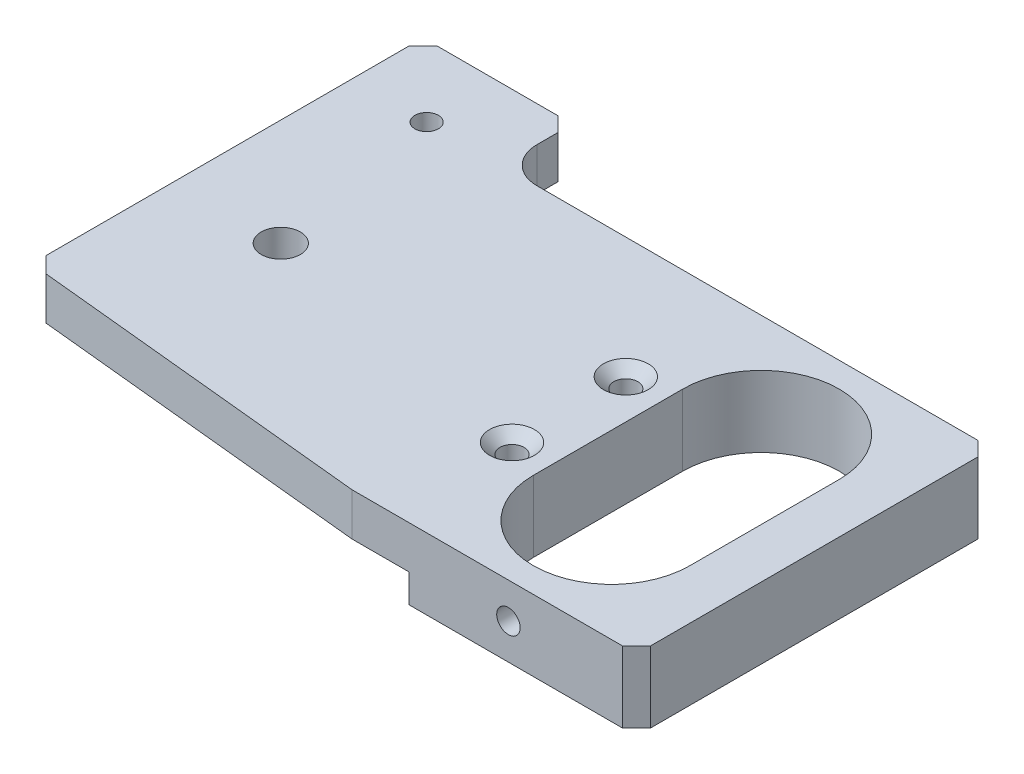
ISO-10303-21;
HEADER;
FILE_DESCRIPTION(('STEP AP214'),'2;1');
FILE_NAME('part.step','',(''),(''),'','','');
FILE_SCHEMA(('AUTOMOTIVE_DESIGN { 1 0 10303 214 1 1 1 1 }'));
ENDSEC;
DATA;
#1=APPLICATION_CONTEXT('core data for automotive mechanical design processes');
#2=APPLICATION_PROTOCOL_DEFINITION('international standard','automotive_design',2000,#1);
#3=PRODUCT_CONTEXT('',#1,'mechanical');
#4=PRODUCT('Part','Part','',(#3));
#5=PRODUCT_RELATED_PRODUCT_CATEGORY('part','',(#4));
#6=PRODUCT_DEFINITION_FORMATION('','',#4);
#7=PRODUCT_DEFINITION_CONTEXT('part definition',#1,'design');
#8=PRODUCT_DEFINITION('design','',#6,#7);
#9=PRODUCT_DEFINITION_SHAPE('','',#8);
#10=(LENGTH_UNIT() NAMED_UNIT(*) SI_UNIT(.MILLI.,.METRE.));
#11=(NAMED_UNIT(*) PLANE_ANGLE_UNIT() SI_UNIT($,.RADIAN.));
#12=(NAMED_UNIT(*) SI_UNIT($,.STERADIAN.) SOLID_ANGLE_UNIT());
#13=UNCERTAINTY_MEASURE_WITH_UNIT(LENGTH_MEASURE(1.E-05),#10,'distance_accuracy_value','');
#14=(GEOMETRIC_REPRESENTATION_CONTEXT(3) GLOBAL_UNCERTAINTY_ASSIGNED_CONTEXT((#13)) GLOBAL_UNIT_ASSIGNED_CONTEXT((#10,
#11,#12)) REPRESENTATION_CONTEXT('',''));
#15=CARTESIAN_POINT('',(0.,0.,0.));
#16=DIRECTION('',(0.,0.,1.));
#17=DIRECTION('',(1.,0.,0.));
#18=AXIS2_PLACEMENT_3D('',#15,#16,#17);
#19=CARTESIAN_POINT('',(0.,0.,0.));
#20=DIRECTION('',(0.,1.,0.));
#21=DIRECTION('',(0.,0.,1.));
#22=AXIS2_PLACEMENT_3D('',#19,#20,#21);
#23=PLANE('',#22);
#24=CARTESIAN_POINT('',(-39.5,0.,-25.));
#25=DIRECTION('',(0.,1.,0.));
#26=DIRECTION('',(0.,0.,1.));
#27=AXIS2_PLACEMENT_3D('',#24,#25,#26);
#28=CIRCLE('',#27,1.65);
#29=CARTESIAN_POINT('',(-39.5,0.,-23.35));
#30=VERTEX_POINT('',#29);
#31=EDGE_CURVE('E531',#30,#30,#28,.T.);
#32=ORIENTED_EDGE('',*,*,#31,.T.);
#33=EDGE_LOOP('',(#32));
#34=FACE_BOUND('',#33,.T.);
#35=CARTESIAN_POINT('',(5.5,0.,-8.));
#36=DIRECTION('',(0.,1.,0.));
#37=DIRECTION('',(0.,0.,1.));
#38=AXIS2_PLACEMENT_3D('',#35,#36,#37);
#39=CIRCLE('',#38,1.69999999999999);
#40=CARTESIAN_POINT('',(5.5,0.,-6.30000000000001));
#41=VERTEX_POINT('',#40);
#42=EDGE_CURVE('E275',#41,#41,#39,.T.);
#43=ORIENTED_EDGE('',*,*,#42,.T.);
#44=EDGE_LOOP('',(#43));
#45=FACE_BOUND('',#44,.T.);
#46=CARTESIAN_POINT('',(5.5,0.,8.));
#47=DIRECTION('',(0.,1.,0.));
#48=DIRECTION('',(0.,0.,1.));
#49=AXIS2_PLACEMENT_3D('',#46,#47,#48);
#50=CIRCLE('',#49,1.69999999999999);
#51=CARTESIAN_POINT('',(5.5,0.,9.69999999999999));
#52=VERTEX_POINT('',#51);
#53=EDGE_CURVE('E270',#52,#52,#50,.T.);
#54=ORIENTED_EDGE('',*,*,#53,.T.);
#55=EDGE_LOOP('',(#54));
#56=FACE_BOUND('',#55,.T.);
#57=CARTESIAN_POINT('',(-35.,0.,0.));
#58=DIRECTION('',(0.,-1.,0.));
#59=DIRECTION('',(0.,0.,-1.));
#60=AXIS2_PLACEMENT_3D('',#57,#58,#59);
#61=CIRCLE('',#60,5.49999999999999);
#62=CARTESIAN_POINT('',(-35.,0.,-5.49999999999999));
#63=VERTEX_POINT('',#62);
#64=EDGE_CURVE('E273',#63,#63,#61,.T.);
#65=ORIENTED_EDGE('',*,*,#64,.F.);
#66=EDGE_LOOP('',(#65));
#67=FACE_BOUND('',#66,.T.);
#68=DIRECTION('',(-1.,0.,0.));
#69=VECTOR('',#68,1.);
#70=CARTESIAN_POINT('',(-50.,0.,-35.));
#71=LINE('',#70,#69);
#72=CARTESIAN_POINT('',(-31.,0.,-35.));
#73=VERTEX_POINT('',#72);
#74=CARTESIAN_POINT('',(-48.,0.,-35.));
#75=VERTEX_POINT('',#74);
#76=EDGE_CURVE('E255',#73,#75,#71,.T.);
#77=ORIENTED_EDGE('',*,*,#76,.F.);
#78=DIRECTION('',(-0.707106781186548,0.,-0.707106781186548));
#79=VECTOR('',#78,1.);
#80=CARTESIAN_POINT('',(-31.,0.,-35.));
#81=LINE('',#80,#79);
#82=CARTESIAN_POINT('',(-29.,0.,-33.));
#83=VERTEX_POINT('',#82);
#84=EDGE_CURVE('E288',#73,#83,#81,.F.);
#85=ORIENTED_EDGE('',*,*,#84,.T.);
#86=DIRECTION('',(0.,0.,-1.));
#87=VECTOR('',#86,1.);
#88=CARTESIAN_POINT('',(-29.,0.,-25.));
#89=LINE('',#88,#87);
#90=CARTESIAN_POINT('',(-29.,0.,-30.));
#91=VERTEX_POINT('',#90);
#92=EDGE_CURVE('E253',#91,#83,#89,.T.);
#93=ORIENTED_EDGE('',*,*,#92,.F.);
#94=CARTESIAN_POINT('',(-24.,0.,-30.));
#95=DIRECTION('',(0.,1.,0.));
#96=DIRECTION('',(0.,0.,1.));
#97=AXIS2_PLACEMENT_3D('',#94,#95,#96);
#98=CIRCLE('',#97,5.);
#99=CARTESIAN_POINT('',(-24.,0.,-25.));
#100=VERTEX_POINT('',#99);
#101=EDGE_CURVE('E42',#91,#100,#98,.T.);
#102=ORIENTED_EDGE('',*,*,#101,.T.);
#103=DIRECTION('',(-1.,0.,0.));
#104=VECTOR('',#103,1.);
#105=CARTESIAN_POINT('',(40.,0.,-25.));
#106=LINE('',#105,#104);
#107=CARTESIAN_POINT('',(8.00000000000001,0.,-25.));
#108=VERTEX_POINT('',#107);
#109=EDGE_CURVE('E231',#108,#100,#106,.T.);
#110=ORIENTED_EDGE('',*,*,#109,.F.);
#111=DIRECTION('',(0.,0.,-1.));
#112=VECTOR('',#111,1.);
#113=CARTESIAN_POINT('',(8.,0.,25.));
#114=LINE('',#113,#112);
#115=CARTESIAN_POINT('',(8.,0.,25.));
#116=VERTEX_POINT('',#115);
#117=EDGE_CURVE('E208',#116,#108,#114,.T.);
#118=ORIENTED_EDGE('',*,*,#117,.F.);
#119=DIRECTION('',(1.,0.,0.));
#120=VECTOR('',#119,1.);
#121=CARTESIAN_POINT('',(0.,0.,25.));
#122=LINE('',#121,#120);
#123=CARTESIAN_POINT('',(0.,0.,25.));
#124=VERTEX_POINT('',#123);
#125=EDGE_CURVE('E236',#124,#116,#122,.T.);
#126=ORIENTED_EDGE('',*,*,#125,.F.);
#127=DIRECTION('',(0.995037190209989,0.,0.0995037190209989));
#128=VECTOR('',#127,1.);
#129=CARTESIAN_POINT('',(-50.,0.,20.));
#130=LINE('',#129,#128);
#131=CARTESIAN_POINT('',(-47.7777777777778,0.,20.2222222222222));
#132=VERTEX_POINT('',#131);
#133=EDGE_CURVE('E261',#132,#124,#130,.T.);
#134=ORIENTED_EDGE('',*,*,#133,.F.);
#135=DIRECTION('',(0.70710678118655,0.,0.707106781186545));
#136=VECTOR('',#135,1.);
#137=CARTESIAN_POINT('',(-47.7777777777778,0.,20.2222222222222));
#138=LINE('',#137,#136);
#139=CARTESIAN_POINT('',(-50.,0.,18.));
#140=VERTEX_POINT('',#139);
#141=EDGE_CURVE('E284',#132,#140,#138,.F.);
#142=ORIENTED_EDGE('',*,*,#141,.T.);
#143=DIRECTION('',(0.,0.,1.));
#144=VECTOR('',#143,1.);
#145=CARTESIAN_POINT('',(-50.,0.,20.));
#146=LINE('',#145,#144);
#147=CARTESIAN_POINT('',(-50.,0.,-33.));
#148=VERTEX_POINT('',#147);
#149=EDGE_CURVE('E258',#148,#140,#146,.T.);
#150=ORIENTED_EDGE('',*,*,#149,.F.);
#151=DIRECTION('',(-0.70710678118655,0.,0.707106781186545));
#152=VECTOR('',#151,1.);
#153=CARTESIAN_POINT('',(-50.,0.,-33.));
#154=LINE('',#153,#152);
#155=EDGE_CURVE('E286',#148,#75,#154,.F.);
#156=ORIENTED_EDGE('',*,*,#155,.T.);
#157=EDGE_LOOP('',(#77,#85,#93,#102,#110,#118,#126,#134,#142,#150,#156));
#158=FACE_BOUND('',#157,.T.);
#159=ADVANCED_FACE('F34',(#34,#45,#56,#67,#158),#23,.F.);
#160=CARTESIAN_POINT('',(40.,6.,25.));
#161=DIRECTION('',(-1.,0.,0.));
#162=DIRECTION('',(0.,0.,1.));
#163=AXIS2_PLACEMENT_3D('',#160,#161,#162);
#164=PLANE('',#163);
#165=DIRECTION('',(0.,0.,-1.));
#166=VECTOR('',#165,1.);
#167=CARTESIAN_POINT('',(40.,6.,25.));
#168=LINE('',#167,#166);
#169=CARTESIAN_POINT('',(40.,6.,23.));
#170=VERTEX_POINT('',#169);
#171=CARTESIAN_POINT('',(40.,6.,-23.));
#172=VERTEX_POINT('',#171);
#173=EDGE_CURVE('E232',#170,#172,#168,.T.);
#174=ORIENTED_EDGE('',*,*,#173,.F.);
#175=DIRECTION('',(0.,-1.,0.));
#176=VECTOR('',#175,1.);
#177=CARTESIAN_POINT('',(40.,6.,23.));
#178=LINE('',#177,#176);
#179=CARTESIAN_POINT('',(40.,-4.,23.));
#180=VERTEX_POINT('',#179);
#181=EDGE_CURVE('E311',#170,#180,#178,.T.);
#182=ORIENTED_EDGE('',*,*,#181,.T.);
#183=DIRECTION('',(0.,0.,1.));
#184=VECTOR('',#183,1.);
#185=CARTESIAN_POINT('',(40.,-4.,25.));
#186=LINE('',#185,#184);
#187=CARTESIAN_POINT('',(40.,-4.,-23.));
#188=VERTEX_POINT('',#187);
#189=EDGE_CURVE('E218',#188,#180,#186,.T.);
#190=ORIENTED_EDGE('',*,*,#189,.F.);
#191=DIRECTION('',(0.,1.,0.));
#192=VECTOR('',#191,1.);
#193=CARTESIAN_POINT('',(40.,6.,-23.));
#194=LINE('',#193,#192);
#195=EDGE_CURVE('E309',#188,#172,#194,.T.);
#196=ORIENTED_EDGE('',*,*,#195,.T.);
#197=EDGE_LOOP('',(#174,#182,#190,#196));
#198=FACE_BOUND('',#197,.T.);
#199=ADVANCED_FACE('F378',(#198),#164,.F.);
#200=CARTESIAN_POINT('',(40.,6.,-25.));
#201=DIRECTION('',(0.,0.,1.));
#202=DIRECTION('',(1.,0.,0.));
#203=AXIS2_PLACEMENT_3D('',#200,#201,#202);
#204=PLANE('',#203);
#205=ORIENTED_EDGE('',*,*,#109,.T.);
#206=DIRECTION('',(0.,-1.,0.));
#207=VECTOR('',#206,1.);
#208=CARTESIAN_POINT('',(-24.,6.,-25.));
#209=LINE('',#208,#207);
#210=CARTESIAN_POINT('',(-24.,6.,-25.));
#211=VERTEX_POINT('',#210);
#212=EDGE_CURVE('E55',#100,#211,#209,.F.);
#213=ORIENTED_EDGE('',*,*,#212,.T.);
#214=DIRECTION('',(-1.,0.,0.));
#215=VECTOR('',#214,1.);
#216=CARTESIAN_POINT('',(40.,6.,-25.));
#217=LINE('',#216,#215);
#218=CARTESIAN_POINT('',(38.,6.,-25.));
#219=VERTEX_POINT('',#218);
#220=EDGE_CURVE('E235',#219,#211,#217,.T.);
#221=ORIENTED_EDGE('',*,*,#220,.F.);
#222=DIRECTION('',(0.,-1.,0.));
#223=VECTOR('',#222,1.);
#224=CARTESIAN_POINT('',(38.,6.,-25.));
#225=LINE('',#224,#223);
#226=CARTESIAN_POINT('',(38.,-4.,-25.));
#227=VERTEX_POINT('',#226);
#228=EDGE_CURVE('E320',#219,#227,#225,.T.);
#229=ORIENTED_EDGE('',*,*,#228,.T.);
#230=DIRECTION('',(1.,0.,0.));
#231=VECTOR('',#230,1.);
#232=CARTESIAN_POINT('',(8.00000000000001,-4.,-25.));
#233=LINE('',#232,#231);
#234=CARTESIAN_POINT('',(8.00000000000001,-4.,-25.));
#235=VERTEX_POINT('',#234);
#236=EDGE_CURVE('E215',#235,#227,#233,.T.);
#237=ORIENTED_EDGE('',*,*,#236,.F.);
#238=DIRECTION('',(0.,1.,0.));
#239=VECTOR('',#238,1.);
#240=CARTESIAN_POINT('',(8.00000000000001,-4.,-25.));
#241=LINE('',#240,#239);
#242=EDGE_CURVE('E228',#235,#108,#241,.T.);
#243=ORIENTED_EDGE('',*,*,#242,.T.);
#244=EDGE_LOOP('',(#205,#213,#221,#229,#237,#243));
#245=FACE_BOUND('',#244,.T.);
#246=ADVANCED_FACE('F384',(#245),#204,.F.);
#247=CARTESIAN_POINT('',(-29.,6.,-25.));
#248=DIRECTION('',(-1.,0.,0.));
#249=DIRECTION('',(0.,0.,1.));
#250=AXIS2_PLACEMENT_3D('',#247,#248,#249);
#251=PLANE('',#250);
#252=DIRECTION('',(0.,0.,-1.));
#253=VECTOR('',#252,1.);
#254=CARTESIAN_POINT('',(-29.,6.,-25.));
#255=LINE('',#254,#253);
#256=CARTESIAN_POINT('',(-29.,6.,-30.));
#257=VERTEX_POINT('',#256);
#258=CARTESIAN_POINT('',(-29.,6.,-33.));
#259=VERTEX_POINT('',#258);
#260=EDGE_CURVE('E238',#257,#259,#255,.T.);
#261=ORIENTED_EDGE('',*,*,#260,.F.);
#262=DIRECTION('',(0.,-1.,0.));
#263=VECTOR('',#262,1.);
#264=CARTESIAN_POINT('',(-29.,0.,-30.));
#265=LINE('',#264,#263);
#266=EDGE_CURVE('E326',#257,#91,#265,.T.);
#267=ORIENTED_EDGE('',*,*,#266,.T.);
#268=ORIENTED_EDGE('',*,*,#92,.T.);
#269=DIRECTION('',(0.,1.,0.));
#270=VECTOR('',#269,1.);
#271=CARTESIAN_POINT('',(-29.,6.,-33.));
#272=LINE('',#271,#270);
#273=EDGE_CURVE('E291',#83,#259,#272,.T.);
#274=ORIENTED_EDGE('',*,*,#273,.T.);
#275=EDGE_LOOP('',(#261,#267,#268,#274));
#276=FACE_BOUND('',#275,.T.);
#277=ADVANCED_FACE('F332',(#276),#251,.F.);
#278=CARTESIAN_POINT('',(-50.,6.,-35.));
#279=DIRECTION('',(0.,0.,1.));
#280=DIRECTION('',(1.,0.,0.));
#281=AXIS2_PLACEMENT_3D('',#278,#279,#280);
#282=PLANE('',#281);
#283=DIRECTION('',(-1.,0.,0.));
#284=VECTOR('',#283,1.);
#285=CARTESIAN_POINT('',(-50.,6.,-35.));
#286=LINE('',#285,#284);
#287=CARTESIAN_POINT('',(-31.,6.,-35.));
#288=VERTEX_POINT('',#287);
#289=CARTESIAN_POINT('',(-48.,6.,-35.));
#290=VERTEX_POINT('',#289);
#291=EDGE_CURVE('E240',#288,#290,#286,.T.);
#292=ORIENTED_EDGE('',*,*,#291,.F.);
#293=DIRECTION('',(0.,-1.,0.));
#294=VECTOR('',#293,1.);
#295=CARTESIAN_POINT('',(-31.,6.,-35.));
#296=LINE('',#295,#294);
#297=EDGE_CURVE('E281',#288,#73,#296,.T.);
#298=ORIENTED_EDGE('',*,*,#297,.T.);
#299=ORIENTED_EDGE('',*,*,#76,.T.);
#300=DIRECTION('',(0.,1.,0.));
#301=VECTOR('',#300,1.);
#302=CARTESIAN_POINT('',(-48.,6.,-35.));
#303=LINE('',#302,#301);
#304=EDGE_CURVE('E267',#75,#290,#303,.T.);
#305=ORIENTED_EDGE('',*,*,#304,.T.);
#306=EDGE_LOOP('',(#292,#298,#299,#305));
#307=FACE_BOUND('',#306,.T.);
#308=ADVANCED_FACE('F346',(#307),#282,.F.);
#309=CARTESIAN_POINT('',(-50.,6.,20.));
#310=DIRECTION('',(1.,0.,0.));
#311=DIRECTION('',(0.,0.,-1.));
#312=AXIS2_PLACEMENT_3D('',#309,#310,#311);
#313=PLANE('',#312);
#314=DIRECTION('',(0.,0.,1.));
#315=VECTOR('',#314,1.);
#316=CARTESIAN_POINT('',(-50.,6.,20.));
#317=LINE('',#316,#315);
#318=CARTESIAN_POINT('',(-50.,6.,-33.));
#319=VERTEX_POINT('',#318);
#320=CARTESIAN_POINT('',(-50.,6.,18.));
#321=VERTEX_POINT('',#320);
#322=EDGE_CURVE('E243',#319,#321,#317,.T.);
#323=ORIENTED_EDGE('',*,*,#322,.F.);
#324=DIRECTION('',(0.,-1.,0.));
#325=VECTOR('',#324,1.);
#326=CARTESIAN_POINT('',(-50.,6.,-33.));
#327=LINE('',#326,#325);
#328=EDGE_CURVE('E306',#319,#148,#327,.T.);
#329=ORIENTED_EDGE('',*,*,#328,.T.);
#330=ORIENTED_EDGE('',*,*,#149,.T.);
#331=DIRECTION('',(0.,1.,0.));
#332=VECTOR('',#331,1.);
#333=CARTESIAN_POINT('',(-50.,6.,18.));
#334=LINE('',#333,#332);
#335=EDGE_CURVE('E304',#140,#321,#334,.T.);
#336=ORIENTED_EDGE('',*,*,#335,.T.);
#337=EDGE_LOOP('',(#323,#329,#330,#336));
#338=FACE_BOUND('',#337,.T.);
#339=ADVANCED_FACE('F354',(#338),#313,.F.);
#340=CARTESIAN_POINT('',(-50.,6.,20.));
#341=DIRECTION('',(0.0995037190209989,0.,-0.995037190209989));
#342=DIRECTION('',(-0.995037190209989,0.,-0.0995037190209989));
#343=AXIS2_PLACEMENT_3D('',#340,#341,#342);
#344=PLANE('',#343);
#345=DIRECTION('',(0.995037190209989,0.,0.0995037190209989));
#346=VECTOR('',#345,1.);
#347=CARTESIAN_POINT('',(-50.,6.,20.));
#348=LINE('',#347,#346);
#349=CARTESIAN_POINT('',(-47.7777777777778,6.,20.2222222222222));
#350=VERTEX_POINT('',#349);
#351=CARTESIAN_POINT('',(0.,6.,25.));
#352=VERTEX_POINT('',#351);
#353=EDGE_CURVE('E246',#350,#352,#348,.T.);
#354=ORIENTED_EDGE('',*,*,#353,.F.);
#355=DIRECTION('',(0.,-1.,0.));
#356=VECTOR('',#355,1.);
#357=CARTESIAN_POINT('',(-47.7777777777778,6.,20.2222222222222));
#358=LINE('',#357,#356);
#359=EDGE_CURVE('E323',#350,#132,#358,.T.);
#360=ORIENTED_EDGE('',*,*,#359,.T.);
#361=ORIENTED_EDGE('',*,*,#133,.T.);
#362=DIRECTION('',(0.,-1.,0.));
#363=VECTOR('',#362,1.);
#364=CARTESIAN_POINT('',(0.,6.,25.));
#365=LINE('',#364,#363);
#366=EDGE_CURVE('E251',#352,#124,#365,.T.);
#367=ORIENTED_EDGE('',*,*,#366,.F.);
#368=EDGE_LOOP('',(#354,#360,#361,#367));
#369=FACE_BOUND('',#368,.T.);
#370=ADVANCED_FACE('F363',(#369),#344,.F.);
#371=CARTESIAN_POINT('',(0.,6.,25.));
#372=DIRECTION('',(0.,0.,-1.));
#373=DIRECTION('',(-1.,0.,0.));
#374=AXIS2_PLACEMENT_3D('',#371,#372,#373);
#375=PLANE('',#374);
#376=CARTESIAN_POINT('',(22.,1.,25.));
#377=DIRECTION('',(0.,0.,1.));
#378=DIRECTION('',(1.,0.,0.));
#379=AXIS2_PLACEMENT_3D('',#376,#377,#378);
#380=CIRCLE('',#379,1.65);
#381=CARTESIAN_POINT('',(23.65,1.,25.));
#382=VERTEX_POINT('',#381);
#383=EDGE_CURVE('E528',#382,#382,#380,.T.);
#384=ORIENTED_EDGE('',*,*,#383,.F.);
#385=EDGE_LOOP('',(#384));
#386=FACE_BOUND('',#385,.T.);
#387=DIRECTION('',(-1.,0.,0.));
#388=VECTOR('',#387,1.);
#389=CARTESIAN_POINT('',(8.,-4.,25.));
#390=LINE('',#389,#388);
#391=CARTESIAN_POINT('',(38.,-4.,25.));
#392=VERTEX_POINT('',#391);
#393=CARTESIAN_POINT('',(8.,-4.,25.));
#394=VERTEX_POINT('',#393);
#395=EDGE_CURVE('E221',#392,#394,#390,.T.);
#396=ORIENTED_EDGE('',*,*,#395,.F.);
#397=DIRECTION('',(0.,1.,0.));
#398=VECTOR('',#397,1.);
#399=CARTESIAN_POINT('',(38.,6.,25.));
#400=LINE('',#399,#398);
#401=CARTESIAN_POINT('',(38.,6.,25.));
#402=VERTEX_POINT('',#401);
#403=EDGE_CURVE('E318',#392,#402,#400,.T.);
#404=ORIENTED_EDGE('',*,*,#403,.T.);
#405=DIRECTION('',(1.,0.,0.));
#406=VECTOR('',#405,1.);
#407=CARTESIAN_POINT('',(0.,6.,25.));
#408=LINE('',#407,#406);
#409=EDGE_CURVE('E248',#352,#402,#408,.T.);
#410=ORIENTED_EDGE('',*,*,#409,.F.);
#411=ORIENTED_EDGE('',*,*,#366,.T.);
#412=ORIENTED_EDGE('',*,*,#125,.T.);
#413=DIRECTION('',(0.,1.,0.));
#414=VECTOR('',#413,1.);
#415=CARTESIAN_POINT('',(8.,-4.,25.));
#416=LINE('',#415,#414);
#417=EDGE_CURVE('E223',#394,#116,#416,.T.);
#418=ORIENTED_EDGE('',*,*,#417,.F.);
#419=EDGE_LOOP('',(#396,#404,#410,#411,#412,#418));
#420=FACE_BOUND('',#419,.T.);
#421=ADVANCED_FACE('F369',(#386,#420),#375,.F.);
#422=CARTESIAN_POINT('',(0.,6.,0.));
#423=DIRECTION('',(0.,1.,0.));
#424=DIRECTION('',(0.,0.,1.));
#425=AXIS2_PLACEMENT_3D('',#422,#423,#424);
#426=PLANE('',#425);
#427=CARTESIAN_POINT('',(-39.5,6.,-25.));
#428=DIRECTION('',(0.,1.,0.));
#429=DIRECTION('',(0.,0.,1.));
#430=AXIS2_PLACEMENT_3D('',#427,#428,#429);
#431=CIRCLE('',#430,1.65);
#432=CARTESIAN_POINT('',(-39.5,6.,-23.35));
#433=VERTEX_POINT('',#432);
#434=EDGE_CURVE('E527',#433,#433,#431,.T.);
#435=ORIENTED_EDGE('',*,*,#434,.F.);
#436=EDGE_LOOP('',(#435));
#437=FACE_BOUND('',#436,.T.);
#438=CARTESIAN_POINT('',(5.5,6.,-8.));
#439=DIRECTION('',(0.,1.,0.));
#440=DIRECTION('',(0.,0.,1.));
#441=AXIS2_PLACEMENT_3D('',#438,#439,#440);
#442=CIRCLE('',#441,3.15);
#443=CARTESIAN_POINT('',(5.5,6.,-4.85));
#444=VERTEX_POINT('',#443);
#445=EDGE_CURVE('E533',#444,#444,#442,.T.);
#446=ORIENTED_EDGE('',*,*,#445,.F.);
#447=EDGE_LOOP('',(#446));
#448=FACE_BOUND('',#447,.T.);
#449=CARTESIAN_POINT('',(5.5,6.,8.));
#450=DIRECTION('',(0.,1.,0.));
#451=DIRECTION('',(0.,0.,1.));
#452=AXIS2_PLACEMENT_3D('',#449,#450,#451);
#453=CIRCLE('',#452,3.15);
#454=CARTESIAN_POINT('',(5.5,6.,11.15));
#455=VERTEX_POINT('',#454);
#456=EDGE_CURVE('E278',#455,#455,#453,.T.);
#457=ORIENTED_EDGE('',*,*,#456,.F.);
#458=EDGE_LOOP('',(#457));
#459=FACE_BOUND('',#458,.T.);
#460=CARTESIAN_POINT('',(-35.,6.,0.));
#461=DIRECTION('',(0.,1.,0.));
#462=DIRECTION('',(0.,0.,1.));
#463=AXIS2_PLACEMENT_3D('',#460,#461,#462);
#464=CIRCLE('',#463,2.75);
#465=CARTESIAN_POINT('',(-35.,6.,2.75));
#466=VERTEX_POINT('',#465);
#467=EDGE_CURVE('E202',#466,#466,#464,.T.);
#468=ORIENTED_EDGE('',*,*,#467,.F.);
#469=EDGE_LOOP('',(#468));
#470=FACE_BOUND('',#469,.T.);
#471=CARTESIAN_POINT('',(22.,6.,-10.5));
#472=DIRECTION('',(0.,1.,0.));
#473=DIRECTION('',(0.,0.,1.));
#474=AXIS2_PLACEMENT_3D('',#471,#472,#473);
#475=CIRCLE('',#474,11.);
#476=CARTESIAN_POINT('',(33.,6.,-10.5));
#477=VERTEX_POINT('',#476);
#478=CARTESIAN_POINT('',(11.,6.,-10.5));
#479=VERTEX_POINT('',#478);
#480=EDGE_CURVE('E171',#477,#479,#475,.T.);
#481=ORIENTED_EDGE('',*,*,#480,.F.);
#482=DIRECTION('',(0.,0.,-1.));
#483=VECTOR('',#482,1.);
#484=CARTESIAN_POINT('',(33.,6.,10.5));
#485=LINE('',#484,#483);
#486=CARTESIAN_POINT('',(33.,6.,10.5));
#487=VERTEX_POINT('',#486);
#488=EDGE_CURVE('E189',#487,#477,#485,.T.);
#489=ORIENTED_EDGE('',*,*,#488,.F.);
#490=CARTESIAN_POINT('',(22.,6.,10.5));
#491=DIRECTION('',(0.,1.,0.));
#492=DIRECTION('',(0.,0.,1.));
#493=AXIS2_PLACEMENT_3D('',#490,#491,#492);
#494=CIRCLE('',#493,11.);
#495=CARTESIAN_POINT('',(11.,6.,10.5));
#496=VERTEX_POINT('',#495);
#497=EDGE_CURVE('E192',#496,#487,#494,.T.);
#498=ORIENTED_EDGE('',*,*,#497,.F.);
#499=DIRECTION('',(0.,0.,1.));
#500=VECTOR('',#499,1.);
#501=CARTESIAN_POINT('',(11.,6.,-10.5));
#502=LINE('',#501,#500);
#503=EDGE_CURVE('E201',#479,#496,#502,.T.);
#504=ORIENTED_EDGE('',*,*,#503,.F.);
#505=EDGE_LOOP('',(#481,#489,#498,#504));
#506=FACE_BOUND('',#505,.T.);
#507=ORIENTED_EDGE('',*,*,#220,.T.);
#508=CARTESIAN_POINT('',(-24.,6.,-30.));
#509=DIRECTION('',(0.,1.,0.));
#510=DIRECTION('',(0.,0.,1.));
#511=AXIS2_PLACEMENT_3D('',#508,#509,#510);
#512=CIRCLE('',#511,5.);
#513=EDGE_CURVE('E11',#211,#257,#512,.F.);
#514=ORIENTED_EDGE('',*,*,#513,.T.);
#515=ORIENTED_EDGE('',*,*,#260,.T.);
#516=DIRECTION('',(0.707106781186548,0.,0.707106781186548));
#517=VECTOR('',#516,1.);
#518=CARTESIAN_POINT('',(2.,6.,-2.));
#519=LINE('',#518,#517);
#520=EDGE_CURVE('E302',#259,#288,#519,.F.);
#521=ORIENTED_EDGE('',*,*,#520,.T.);
#522=ORIENTED_EDGE('',*,*,#291,.T.);
#523=DIRECTION('',(0.70710678118655,0.,-0.707106781186545));
#524=VECTOR('',#523,1.);
#525=CARTESIAN_POINT('',(-41.4999999999998,6.,-41.5000000000001));
#526=LINE('',#525,#524);
#527=EDGE_CURVE('E300',#290,#319,#526,.F.);
#528=ORIENTED_EDGE('',*,*,#527,.T.);
#529=ORIENTED_EDGE('',*,*,#322,.T.);
#530=DIRECTION('',(-0.70710678118655,0.,-0.707106781186545));
#531=VECTOR('',#530,1.);
#532=CARTESIAN_POINT('',(-33.9999999999999,6.,34.0000000000001));
#533=LINE('',#532,#531);
#534=EDGE_CURVE('E294',#321,#350,#533,.F.);
#535=ORIENTED_EDGE('',*,*,#534,.T.);
#536=ORIENTED_EDGE('',*,*,#353,.T.);
#537=ORIENTED_EDGE('',*,*,#409,.T.);
#538=DIRECTION('',(-0.707106781186548,0.,0.707106781186548));
#539=VECTOR('',#538,1.);
#540=CARTESIAN_POINT('',(31.5,6.,31.5));
#541=LINE('',#540,#539);
#542=EDGE_CURVE('E298',#402,#170,#541,.F.);
#543=ORIENTED_EDGE('',*,*,#542,.T.);
#544=ORIENTED_EDGE('',*,*,#173,.T.);
#545=DIRECTION('',(0.707106781186548,0.,0.707106781186548));
#546=VECTOR('',#545,1.);
#547=CARTESIAN_POINT('',(31.5,6.,-31.5));
#548=LINE('',#547,#546);
#549=EDGE_CURVE('E296',#172,#219,#548,.F.);
#550=ORIENTED_EDGE('',*,*,#549,.T.);
#551=EDGE_LOOP('',(#507,#514,#515,#521,#522,#528,#529,#535,#536,#537,#543,#544,#550));
#552=FACE_BOUND('',#551,.T.);
#553=ADVANCED_FACE('F343',(#437,#448,#459,#470,#506,#552),#426,.T.);
#554=CARTESIAN_POINT('',(8.,-4.,25.));
#555=DIRECTION('',(1.,0.,0.));
#556=DIRECTION('',(0.,0.,-1.));
#557=AXIS2_PLACEMENT_3D('',#554,#555,#556);
#558=PLANE('',#557);
#559=ORIENTED_EDGE('',*,*,#117,.T.);
#560=ORIENTED_EDGE('',*,*,#242,.F.);
#561=DIRECTION('',(0.,0.,-1.));
#562=VECTOR('',#561,1.);
#563=CARTESIAN_POINT('',(8.,-4.,25.));
#564=LINE('',#563,#562);
#565=EDGE_CURVE('E212',#394,#235,#564,.T.);
#566=ORIENTED_EDGE('',*,*,#565,.F.);
#567=ORIENTED_EDGE('',*,*,#417,.T.);
#568=EDGE_LOOP('',(#559,#560,#566,#567));
#569=FACE_BOUND('',#568,.T.);
#570=ADVANCED_FACE('F469',(#569),#558,.F.);
#571=CARTESIAN_POINT('',(0.,-4.,0.));
#572=DIRECTION('',(0.,-1.,0.));
#573=DIRECTION('',(0.,0.,-1.));
#574=AXIS2_PLACEMENT_3D('',#571,#572,#573);
#575=PLANE('',#574);
#576=CARTESIAN_POINT('',(22.,-4.,-10.5));
#577=DIRECTION('',(0.,1.,0.));
#578=DIRECTION('',(0.,0.,1.));
#579=AXIS2_PLACEMENT_3D('',#576,#577,#578);
#580=CIRCLE('',#579,11.);
#581=CARTESIAN_POINT('',(33.,-4.,-10.5));
#582=VERTEX_POINT('',#581);
#583=CARTESIAN_POINT('',(11.,-4.,-10.5));
#584=VERTEX_POINT('',#583);
#585=EDGE_CURVE('E168',#582,#584,#580,.T.);
#586=ORIENTED_EDGE('',*,*,#585,.T.);
#587=DIRECTION('',(0.,0.,1.));
#588=VECTOR('',#587,1.);
#589=CARTESIAN_POINT('',(11.,-4.,-10.5));
#590=LINE('',#589,#588);
#591=CARTESIAN_POINT('',(11.,-4.,10.5));
#592=VERTEX_POINT('',#591);
#593=EDGE_CURVE('E180',#584,#592,#590,.T.);
#594=ORIENTED_EDGE('',*,*,#593,.T.);
#595=CARTESIAN_POINT('',(22.,-4.,10.5));
#596=DIRECTION('',(0.,1.,0.));
#597=DIRECTION('',(0.,0.,1.));
#598=AXIS2_PLACEMENT_3D('',#595,#596,#597);
#599=CIRCLE('',#598,11.);
#600=CARTESIAN_POINT('',(33.,-4.,10.5));
#601=VERTEX_POINT('',#600);
#602=EDGE_CURVE('E184',#592,#601,#599,.T.);
#603=ORIENTED_EDGE('',*,*,#602,.T.);
#604=DIRECTION('',(0.,0.,-1.));
#605=VECTOR('',#604,1.);
#606=CARTESIAN_POINT('',(33.,-4.,10.5));
#607=LINE('',#606,#605);
#608=EDGE_CURVE('E176',#601,#582,#607,.T.);
#609=ORIENTED_EDGE('',*,*,#608,.T.);
#610=EDGE_LOOP('',(#586,#594,#603,#609));
#611=FACE_BOUND('',#610,.T.);
#612=ORIENTED_EDGE('',*,*,#189,.T.);
#613=DIRECTION('',(0.707106781186548,0.,-0.707106781186548));
#614=VECTOR('',#613,1.);
#615=CARTESIAN_POINT('',(31.5,-4.,31.5));
#616=LINE('',#615,#614);
#617=EDGE_CURVE('E316',#180,#392,#616,.F.);
#618=ORIENTED_EDGE('',*,*,#617,.T.);
#619=ORIENTED_EDGE('',*,*,#395,.T.);
#620=ORIENTED_EDGE('',*,*,#565,.T.);
#621=ORIENTED_EDGE('',*,*,#236,.T.);
#622=DIRECTION('',(-0.707106781186548,0.,-0.707106781186548));
#623=VECTOR('',#622,1.);
#624=CARTESIAN_POINT('',(31.5,-4.,-31.5));
#625=LINE('',#624,#623);
#626=EDGE_CURVE('E314',#227,#188,#625,.F.);
#627=ORIENTED_EDGE('',*,*,#626,.T.);
#628=EDGE_LOOP('',(#612,#618,#619,#620,#621,#627));
#629=FACE_BOUND('',#628,.T.);
#630=ADVANCED_FACE('F186',(#611,#629),#575,.T.);
#631=CARTESIAN_POINT('',(22.,-4.,-10.5));
#632=DIRECTION('',(0.,1.,0.));
#633=DIRECTION('',(0.,0.,1.));
#634=AXIS2_PLACEMENT_3D('',#631,#632,#633);
#635=CYLINDRICAL_SURFACE('',#634,11.);
#636=ORIENTED_EDGE('',*,*,#480,.T.);
#637=DIRECTION('',(0.,1.,0.));
#638=VECTOR('',#637,1.);
#639=CARTESIAN_POINT('',(11.,-4.,-10.5));
#640=LINE('',#639,#638);
#641=EDGE_CURVE('E164',#584,#479,#640,.T.);
#642=ORIENTED_EDGE('',*,*,#641,.F.);
#643=ORIENTED_EDGE('',*,*,#585,.F.);
#644=DIRECTION('',(0.,1.,0.));
#645=VECTOR('',#644,1.);
#646=CARTESIAN_POINT('',(33.,-4.,-10.5));
#647=LINE('',#646,#645);
#648=EDGE_CURVE('E206',#582,#477,#647,.T.);
#649=ORIENTED_EDGE('',*,*,#648,.T.);
#650=EDGE_LOOP('',(#636,#642,#643,#649));
#651=FACE_BOUND('',#650,.T.);
#652=ADVANCED_FACE('F166',(#651),#635,.F.);
#653=CARTESIAN_POINT('',(33.,-4.,10.5));
#654=DIRECTION('',(1.,0.,0.));
#655=DIRECTION('',(0.,0.,-1.));
#656=AXIS2_PLACEMENT_3D('',#653,#654,#655);
#657=PLANE('',#656);
#658=ORIENTED_EDGE('',*,*,#488,.T.);
#659=ORIENTED_EDGE('',*,*,#648,.F.);
#660=ORIENTED_EDGE('',*,*,#608,.F.);
#661=DIRECTION('',(0.,1.,0.));
#662=VECTOR('',#661,1.);
#663=CARTESIAN_POINT('',(33.,-4.,10.5));
#664=LINE('',#663,#662);
#665=EDGE_CURVE('E209',#601,#487,#664,.T.);
#666=ORIENTED_EDGE('',*,*,#665,.T.);
#667=EDGE_LOOP('',(#658,#659,#660,#666));
#668=FACE_BOUND('',#667,.T.);
#669=ADVANCED_FACE('F495',(#668),#657,.F.);
#670=CARTESIAN_POINT('',(22.,-4.,10.5));
#671=DIRECTION('',(0.,1.,0.));
#672=DIRECTION('',(0.,0.,1.));
#673=AXIS2_PLACEMENT_3D('',#670,#671,#672);
#674=CYLINDRICAL_SURFACE('',#673,11.);
#675=CARTESIAN_POINT('',(23.65,1.,21.3755459633069));
#676=CARTESIAN_POINT('',(23.6499961951801,1.09212012621895,21.3755475033545));
#677=CARTESIAN_POINT('',(23.6422592602734,1.18429372582578,21.3767290691301));
#678=CARTESIAN_POINT('',(23.611524163227,1.36606384637144,21.3813244628356));
#679=CARTESIAN_POINT('',(23.5885111154289,1.45565776462801,21.3847404680457));
#680=CARTESIAN_POINT('',(23.5279277870789,1.62961113099159,21.3934093288485));
#681=CARTESIAN_POINT('',(23.4903686784954,1.71397453879638,21.3986607744469));
#682=CARTESIAN_POINT('',(23.4017856939657,1.87518973384929,21.4104071352446));
#683=CARTESIAN_POINT('',(23.3507636717286,1.95204255323573,21.4169018792203));
#684=CARTESIAN_POINT('',(23.2362669266041,2.09668219842977,21.4304611817284));
#685=CARTESIAN_POINT('',(23.172705661433,2.16440017474742,21.4375294870386));
#686=CARTESIAN_POINT('',(23.0351215659888,2.28825123422105,21.4514060498595));
#687=CARTESIAN_POINT('',(22.9610981608652,2.34438368038369,21.4582142930548));
#688=CARTESIAN_POINT('',(22.804249993858,2.4437242948605,21.47084282171));
#689=CARTESIAN_POINT('',(22.7213846501023,2.48686906535471,21.4766582027913));
#690=CARTESIAN_POINT('',(22.5494817351177,2.55860275868899,21.4866042742105));
#691=CARTESIAN_POINT('',(22.4604444902977,2.58719245062718,21.4907350535614));
#692=CARTESIAN_POINT('',(22.2794342353996,2.62879572738392,21.4968200627756));
#693=CARTESIAN_POINT('',(22.1874882728288,2.64192459902588,21.4987903947608));
#694=CARTESIAN_POINT('',(22.0026787244214,2.65259152830738,21.5003876924654));
#695=CARTESIAN_POINT('',(21.9098151898827,2.65013045265166,21.5000147884543));
#696=CARTESIAN_POINT('',(21.7265931099794,2.62977832846133,21.4969804962687));
#697=CARTESIAN_POINT('',(21.63622043946,2.61201131102937,21.4943375041773));
#698=CARTESIAN_POINT('',(21.4597538879425,2.56174633304517,21.4870805025064));
#699=CARTESIAN_POINT('',(21.3736601171352,2.52924799334842,21.4824664421971));
#700=CARTESIAN_POINT('',(21.2078198411526,2.45031590339119,21.4717541326053));
#701=CARTESIAN_POINT('',(21.128098560444,2.40382993838038,21.465650338672));
#702=CARTESIAN_POINT('',(20.9775413021348,2.29828028696301,21.4526388206996));
#703=CARTESIAN_POINT('',(20.9067059099011,2.23921577262245,21.445731043755));
#704=CARTESIAN_POINT('',(20.7752000690051,2.10949470629075,21.4318017401189));
#705=CARTESIAN_POINT('',(20.7146364375396,2.03872986583287,21.4247797628558));
#706=CARTESIAN_POINT('',(20.6062274072731,1.88798481516389,21.4114797489887));
#707=CARTESIAN_POINT('',(20.558382086792,1.80800454820809,21.4052017169661));
#708=CARTESIAN_POINT('',(20.4767533901193,1.64098764076529,21.3941005281554));
#709=CARTESIAN_POINT('',(20.4429809950291,1.55394555297137,21.3892785082982));
#710=CARTESIAN_POINT('',(20.3905643017023,1.37533621933787,21.3816554318896));
#711=CARTESIAN_POINT('',(20.3719189372894,1.28376929289857,21.3788542329093));
#712=CARTESIAN_POINT('',(20.3504320790468,1.09965990146476,21.3756169653453));
#713=CARTESIAN_POINT('',(20.3474391640844,1.00713549297831,21.3751582368283));
#714=CARTESIAN_POINT('',(20.356940372782,0.82290638570093,21.3765976873087));
#715=CARTESIAN_POINT('',(20.3694340158947,0.73120166156416,21.3784957931736));
#716=CARTESIAN_POINT('',(20.4094252675196,0.551684200237807,21.384414227076));
#717=CARTESIAN_POINT('',(20.436847436194,0.463854274564239,21.3884238813114));
#718=CARTESIAN_POINT('',(20.505838848582,0.294037498746534,21.3981048200834));
#719=CARTESIAN_POINT('',(20.5474087909597,0.212050937408984,21.4037761866789));
#720=CARTESIAN_POINT('',(20.6438795420514,0.0555694136314547,21.4161949125577));
#721=CARTESIAN_POINT('',(20.6988783698206,-0.0188644920077959,21.4229500520799));
#722=CARTESIAN_POINT('',(20.8205094147908,-0.157500145861191,21.4367517537669));
#723=CARTESIAN_POINT('',(20.8871422898085,-0.221701315099265,21.4437983323932));
#724=CARTESIAN_POINT('',(21.030816818409,-0.338592867296939,21.4574597573912));
#725=CARTESIAN_POINT('',(21.1079405605508,-0.391182901066722,21.4640705180647));
#726=CARTESIAN_POINT('',(21.2700157117099,-0.482660195788903,21.4760519553522));
#727=CARTESIAN_POINT('',(21.3549669065035,-0.521547831611529,21.4814226658902));
#728=CARTESIAN_POINT('',(21.5299722045527,-0.58435611673683,21.4903009662687));
#729=CARTESIAN_POINT('',(21.6200062553703,-0.608331633786195,21.4938153788969));
#730=CARTESIAN_POINT('',(21.8028791029487,-0.640812667491218,21.4986137432259));
#731=CARTESIAN_POINT('',(21.8957177140564,-0.649319205874054,21.4998978422388));
#732=CARTESIAN_POINT('',(22.0805910499469,-0.650595875004342,21.5000894196506));
#733=CARTESIAN_POINT('',(22.1726247272333,-0.643519548964671,21.4990200872618));
#734=CARTESIAN_POINT('',(22.3541777748554,-0.614160472737165,21.4946717157106));
#735=CARTESIAN_POINT('',(22.4436971532362,-0.591877771210584,21.4913926836193));
#736=CARTESIAN_POINT('',(22.6176383118176,-0.532792936872739,21.4829916541671));
#737=CARTESIAN_POINT('',(22.7020637724637,-0.496001435347173,21.4778710064864));
#738=CARTESIAN_POINT('',(22.8635672296863,-0.40895976321854,21.4663491794505));
#739=CARTESIAN_POINT('',(22.9406449876128,-0.358709155671622,21.4599479585237));
#740=CARTESIAN_POINT('',(23.0860438437112,-0.245620531287908,21.446501616998));
#741=CARTESIAN_POINT('',(23.154276273091,-0.182669151602025,21.4394510326854));
#742=CARTESIAN_POINT('',(23.2792648922929,-0.0462044196114812,21.425541018579));
#743=CARTESIAN_POINT('',(23.3360183847888,0.0273114082067794,21.4186816340392));
#744=CARTESIAN_POINT('',(23.4367244190527,0.183303881555788,21.4058893243203));
#745=CARTESIAN_POINT('',(23.4806032372033,0.265828558724013,21.3999618217268));
#746=CARTESIAN_POINT('',(23.5538117525925,0.43712645443963,21.389768000218));
#747=CARTESIAN_POINT('',(23.5831565483239,0.525893078643603,21.3854999583872));
#748=CARTESIAN_POINT('',(23.6198044707903,0.679215179882122,21.3800943407731));
#749=CARTESIAN_POINT('',(23.6311104675846,0.742823736616698,21.3783977432062));
#750=CARTESIAN_POINT('',(23.6462095163423,0.870946120907783,21.3761230222371));
#751=CARTESIAN_POINT('',(23.6500026656858,0.935459936719573,21.3755448843377));
#752=CARTESIAN_POINT('',(23.65,1.,21.3755459633069));
#753=B_SPLINE_CURVE_WITH_KNOTS('',3,(#675,#676,#677,#678,#679,#680,#681,#682,#683,#684,#685,
#686,#687,#688,#689,#690,#691,#692,#693,#694,#695,#696,#697,#698,#699,#700,#701,#702,#703,#704,
#705,#706,#707,#708,#709,#710,#711,#712,#713,#714,#715,#716,#717,#718,#719,#720,#721,#722,#723,
#724,#725,#726,#727,#728,#729,#730,#731,#732,#733,#734,#735,#736,#737,#738,#739,#740,#741,#742,
#743,#744,#745,#746,#747,#748,#749,#750,#751,#752),.UNSPECIFIED.,.T.,.F.,(4,2,2,2,2,2,2,2,2,2,2,
2,2,2,2,2,2,2,2,2,2,2,2,2,2,2,2,2,2,2,2,2,2,2,2,2,2,2,4),(0.,0.276124476985354,
0.552518416517982,0.828700493869244,1.10484456352746,1.38296574514018,1.66110221428598,
1.9405751431636,2.2200333030095,2.49739415787837,2.77473959333311,3.04985848767301,
3.32498446323341,3.60115048025099,3.87733468044199,4.15623499132896,4.43513701965784,
4.71425626950452,4.99335584488774,5.26975036064117,5.54613630009909,5.82113834288111,
6.09615396814728,6.37324034601432,6.65034239607981,6.92975291528866,7.20915578979039,
7.48752444980198,7.76587472287519,8.04149459984558,8.31711359482104,8.59253100483615,
8.86795735723816,9.14596045012065,9.42402879260547,9.70365966707423,9.98299943790119,
10.1764568608077,10.3699117761381),.UNSPECIFIED.);
#754=CARTESIAN_POINT('',(23.65,1.,21.3755459633069));
#755=VERTEX_POINT('',#754);
#756=EDGE_CURVE('E520',#755,#755,#753,.T.);
#757=ORIENTED_EDGE('',*,*,#756,.T.);
#758=EDGE_LOOP('',(#757));
#759=FACE_BOUND('',#758,.T.);
#760=ORIENTED_EDGE('',*,*,#497,.T.);
#761=ORIENTED_EDGE('',*,*,#665,.F.);
#762=ORIENTED_EDGE('',*,*,#602,.F.);
#763=DIRECTION('',(0.,1.,0.));
#764=VECTOR('',#763,1.);
#765=CARTESIAN_POINT('',(11.,-4.,10.5));
#766=LINE('',#765,#764);
#767=EDGE_CURVE('E175',#592,#496,#766,.T.);
#768=ORIENTED_EDGE('',*,*,#767,.T.);
#769=EDGE_LOOP('',(#760,#761,#762,#768));
#770=FACE_BOUND('',#769,.T.);
#771=ADVANCED_FACE('F490',(#759,#770),#674,.F.);
#772=CARTESIAN_POINT('',(11.,-4.,-10.5));
#773=DIRECTION('',(-1.,0.,0.));
#774=DIRECTION('',(0.,0.,1.));
#775=AXIS2_PLACEMENT_3D('',#772,#773,#774);
#776=PLANE('',#775);
#777=ORIENTED_EDGE('',*,*,#503,.T.);
#778=ORIENTED_EDGE('',*,*,#767,.F.);
#779=ORIENTED_EDGE('',*,*,#593,.F.);
#780=ORIENTED_EDGE('',*,*,#641,.T.);
#781=EDGE_LOOP('',(#777,#778,#779,#780));
#782=FACE_BOUND('',#781,.T.);
#783=ADVANCED_FACE('F181',(#782),#776,.F.);
#784=CARTESIAN_POINT('',(-35.,0.,0.));
#785=DIRECTION('',(0.,-1.,0.));
#786=DIRECTION('',(0.,0.,-1.));
#787=AXIS2_PLACEMENT_3D('',#784,#785,#786);
#788=CYLINDRICAL_SURFACE('',#787,2.75);
#789=ORIENTED_EDGE('',*,*,#467,.T.);
#790=EDGE_LOOP('',(#789));
#791=FACE_BOUND('',#790,.T.);
#792=CARTESIAN_POINT('',(-35.,1.7,0.));
#793=DIRECTION('',(0.,-1.,0.));
#794=DIRECTION('',(0.,0.,-1.));
#795=AXIS2_PLACEMENT_3D('',#792,#793,#794);
#796=CIRCLE('',#795,2.75);
#797=CARTESIAN_POINT('',(-35.,1.7,-2.75));
#798=VERTEX_POINT('',#797);
#799=EDGE_CURVE('E195',#798,#798,#796,.T.);
#800=ORIENTED_EDGE('',*,*,#799,.T.);
#801=EDGE_LOOP('',(#800));
#802=FACE_BOUND('',#801,.T.);
#803=ADVANCED_FACE('F550',(#791,#802),#788,.F.);
#804=CARTESIAN_POINT('',(-32.25,1.7,0.));
#805=DIRECTION('',(0.,1.,0.));
#806=DIRECTION('',(0.,0.,1.));
#807=AXIS2_PLACEMENT_3D('',#804,#805,#806);
#808=PLANE('',#807);
#809=ORIENTED_EDGE('',*,*,#799,.F.);
#810=EDGE_LOOP('',(#809));
#811=FACE_BOUND('',#810,.T.);
#812=CARTESIAN_POINT('',(-35.,1.7,0.));
#813=DIRECTION('',(0.,-1.,0.));
#814=DIRECTION('',(0.,0.,-1.));
#815=AXIS2_PLACEMENT_3D('',#812,#813,#814);
#816=CIRCLE('',#815,5.5);
#817=CARTESIAN_POINT('',(-35.,1.7,-5.5));
#818=VERTEX_POINT('',#817);
#819=EDGE_CURVE('E543',#818,#818,#816,.T.);
#820=ORIENTED_EDGE('',*,*,#819,.T.);
#821=EDGE_LOOP('',(#820));
#822=FACE_BOUND('',#821,.T.);
#823=ADVANCED_FACE('F552',(#811,#822),#808,.F.);
#824=CARTESIAN_POINT('',(-35.,0.,0.));
#825=DIRECTION('',(0.,-1.,0.));
#826=DIRECTION('',(0.,0.,-1.));
#827=AXIS2_PLACEMENT_3D('',#824,#825,#826);
#828=CYLINDRICAL_SURFACE('',#827,5.5);
#829=ORIENTED_EDGE('',*,*,#819,.F.);
#830=EDGE_LOOP('',(#829));
#831=FACE_BOUND('',#830,.T.);
#832=ORIENTED_EDGE('',*,*,#64,.T.);
#833=EDGE_LOOP('',(#832));
#834=FACE_BOUND('',#833,.T.);
#835=ADVANCED_FACE('F554',(#831,#834),#828,.F.);
#836=CARTESIAN_POINT('',(5.5,6.,8.));
#837=DIRECTION('',(0.,1.,0.));
#838=DIRECTION('',(0.,0.,1.));
#839=AXIS2_PLACEMENT_3D('',#836,#837,#838);
#840=CYLINDRICAL_SURFACE('',#839,1.69999999999999);
#841=CARTESIAN_POINT('',(5.5,4.55,8.));
#842=DIRECTION('',(0.,1.,0.));
#843=DIRECTION('',(0.,0.,1.));
#844=AXIS2_PLACEMENT_3D('',#841,#842,#843);
#845=CIRCLE('',#844,1.7);
#846=CARTESIAN_POINT('',(5.5,4.55,9.7));
#847=VERTEX_POINT('',#846);
#848=EDGE_CURVE('E274',#847,#847,#845,.T.);
#849=ORIENTED_EDGE('',*,*,#848,.T.);
#850=EDGE_LOOP('',(#849));
#851=FACE_BOUND('',#850,.T.);
#852=ORIENTED_EDGE('',*,*,#53,.F.);
#853=EDGE_LOOP('',(#852));
#854=FACE_BOUND('',#853,.T.);
#855=ADVANCED_FACE('F560',(#851,#854),#840,.F.);
#856=CARTESIAN_POINT('',(5.5,6.,8.));
#857=DIRECTION('',(0.,1.,0.));
#858=DIRECTION('',(0.,0.,1.));
#859=AXIS2_PLACEMENT_3D('',#856,#857,#858);
#860=CONICAL_SURFACE('',#859,3.15,0.785398163397448);
#861=ORIENTED_EDGE('',*,*,#848,.F.);
#862=EDGE_LOOP('',(#861));
#863=FACE_BOUND('',#862,.T.);
#864=ORIENTED_EDGE('',*,*,#456,.T.);
#865=EDGE_LOOP('',(#864));
#866=FACE_BOUND('',#865,.T.);
#867=ADVANCED_FACE('F621',(#863,#866),#860,.F.);
#868=CARTESIAN_POINT('',(5.5,6.,-8.));
#869=DIRECTION('',(0.,1.,0.));
#870=DIRECTION('',(0.,0.,1.));
#871=AXIS2_PLACEMENT_3D('',#868,#869,#870);
#872=CYLINDRICAL_SURFACE('',#871,1.69999999999999);
#873=CARTESIAN_POINT('',(5.5,4.55,-8.));
#874=DIRECTION('',(0.,1.,0.));
#875=DIRECTION('',(0.,0.,1.));
#876=AXIS2_PLACEMENT_3D('',#873,#874,#875);
#877=CIRCLE('',#876,1.7);
#878=CARTESIAN_POINT('',(5.5,4.55,-6.3));
#879=VERTEX_POINT('',#878);
#880=EDGE_CURVE('E279',#879,#879,#877,.T.);
#881=ORIENTED_EDGE('',*,*,#880,.T.);
#882=EDGE_LOOP('',(#881));
#883=FACE_BOUND('',#882,.T.);
#884=ORIENTED_EDGE('',*,*,#42,.F.);
#885=EDGE_LOOP('',(#884));
#886=FACE_BOUND('',#885,.T.);
#887=ADVANCED_FACE('F630',(#883,#886),#872,.F.);
#888=CARTESIAN_POINT('',(5.5,6.,-8.));
#889=DIRECTION('',(0.,1.,0.));
#890=DIRECTION('',(0.,0.,1.));
#891=AXIS2_PLACEMENT_3D('',#888,#889,#890);
#892=CONICAL_SURFACE('',#891,3.15,0.785398163397448);
#893=ORIENTED_EDGE('',*,*,#880,.F.);
#894=EDGE_LOOP('',(#893));
#895=FACE_BOUND('',#894,.T.);
#896=ORIENTED_EDGE('',*,*,#445,.T.);
#897=EDGE_LOOP('',(#896));
#898=FACE_BOUND('',#897,.T.);
#899=ADVANCED_FACE('F421',(#895,#898),#892,.F.);
#900=CARTESIAN_POINT('',(-31.,6.,-35.));
#901=DIRECTION('',(-0.707106781186547,0.,0.707106781186547));
#902=DIRECTION('',(0.,-1.,0.));
#903=AXIS2_PLACEMENT_3D('',#900,#901,#902);
#904=PLANE('',#903);
#905=ORIENTED_EDGE('',*,*,#520,.F.);
#906=ORIENTED_EDGE('',*,*,#273,.F.);
#907=ORIENTED_EDGE('',*,*,#84,.F.);
#908=ORIENTED_EDGE('',*,*,#297,.F.);
#909=EDGE_LOOP('',(#905,#906,#907,#908));
#910=FACE_BOUND('',#909,.T.);
#911=ADVANCED_FACE('F340',(#910),#904,.F.);
#912=CARTESIAN_POINT('',(-50.,6.,-33.));
#913=DIRECTION('',(0.707106781186545,0.,0.70710678118655));
#914=DIRECTION('',(0.,-1.,0.));
#915=AXIS2_PLACEMENT_3D('',#912,#913,#914);
#916=PLANE('',#915);
#917=ORIENTED_EDGE('',*,*,#527,.F.);
#918=ORIENTED_EDGE('',*,*,#304,.F.);
#919=ORIENTED_EDGE('',*,*,#155,.F.);
#920=ORIENTED_EDGE('',*,*,#328,.F.);
#921=EDGE_LOOP('',(#917,#918,#919,#920));
#922=FACE_BOUND('',#921,.T.);
#923=ADVANCED_FACE('F349',(#922),#916,.F.);
#924=CARTESIAN_POINT('',(40.,6.,23.));
#925=DIRECTION('',(-0.707106781186547,0.,-0.707106781186547));
#926=DIRECTION('',(0.,-1.,0.));
#927=AXIS2_PLACEMENT_3D('',#924,#925,#926);
#928=PLANE('',#927);
#929=ORIENTED_EDGE('',*,*,#542,.F.);
#930=ORIENTED_EDGE('',*,*,#403,.F.);
#931=ORIENTED_EDGE('',*,*,#617,.F.);
#932=ORIENTED_EDGE('',*,*,#181,.F.);
#933=EDGE_LOOP('',(#929,#930,#931,#932));
#934=FACE_BOUND('',#933,.T.);
#935=ADVANCED_FACE('F375',(#934),#928,.F.);
#936=CARTESIAN_POINT('',(38.,6.,-25.));
#937=DIRECTION('',(-0.707106781186547,0.,0.707106781186547));
#938=DIRECTION('',(0.,-1.,0.));
#939=AXIS2_PLACEMENT_3D('',#936,#937,#938);
#940=PLANE('',#939);
#941=ORIENTED_EDGE('',*,*,#549,.F.);
#942=ORIENTED_EDGE('',*,*,#195,.F.);
#943=ORIENTED_EDGE('',*,*,#626,.F.);
#944=ORIENTED_EDGE('',*,*,#228,.F.);
#945=EDGE_LOOP('',(#941,#942,#943,#944));
#946=FACE_BOUND('',#945,.T.);
#947=ADVANCED_FACE('F383',(#946),#940,.F.);
#948=CARTESIAN_POINT('',(-47.7777777777778,6.,20.2222222222222));
#949=DIRECTION('',(0.707106781186545,0.,-0.70710678118655));
#950=DIRECTION('',(0.,-1.,0.));
#951=AXIS2_PLACEMENT_3D('',#948,#949,#950);
#952=PLANE('',#951);
#953=ORIENTED_EDGE('',*,*,#534,.F.);
#954=ORIENTED_EDGE('',*,*,#335,.F.);
#955=ORIENTED_EDGE('',*,*,#141,.F.);
#956=ORIENTED_EDGE('',*,*,#359,.F.);
#957=EDGE_LOOP('',(#953,#954,#955,#956));
#958=FACE_BOUND('',#957,.T.);
#959=ADVANCED_FACE('F358',(#958),#952,.F.);
#960=CARTESIAN_POINT('',(-24.,6.,-30.));
#961=DIRECTION('',(0.,1.,0.));
#962=DIRECTION('',(0.,0.,1.));
#963=AXIS2_PLACEMENT_3D('',#960,#961,#962);
#964=CYLINDRICAL_SURFACE('',#963,5.);
#965=ORIENTED_EDGE('',*,*,#513,.F.);
#966=ORIENTED_EDGE('',*,*,#212,.F.);
#967=ORIENTED_EDGE('',*,*,#101,.F.);
#968=ORIENTED_EDGE('',*,*,#266,.F.);
#969=EDGE_LOOP('',(#965,#966,#967,#968));
#970=FACE_BOUND('',#969,.T.);
#971=ADVANCED_FACE('F36',(#970),#964,.F.);
#972=CARTESIAN_POINT('',(-39.5,6.,-25.));
#973=DIRECTION('',(0.,1.,0.));
#974=DIRECTION('',(0.,0.,1.));
#975=AXIS2_PLACEMENT_3D('',#972,#973,#974);
#976=CYLINDRICAL_SURFACE('',#975,1.65);
#977=ORIENTED_EDGE('',*,*,#434,.T.);
#978=EDGE_LOOP('',(#977));
#979=FACE_BOUND('',#978,.T.);
#980=ORIENTED_EDGE('',*,*,#31,.F.);
#981=EDGE_LOOP('',(#980));
#982=FACE_BOUND('',#981,.T.);
#983=ADVANCED_FACE('F386',(#979,#982),#976,.F.);
#984=CARTESIAN_POINT('',(22.,1.,25.));
#985=DIRECTION('',(0.,0.,1.));
#986=DIRECTION('',(1.,0.,0.));
#987=AXIS2_PLACEMENT_3D('',#984,#985,#986);
#988=CYLINDRICAL_SURFACE('',#987,1.65);
#989=ORIENTED_EDGE('',*,*,#756,.F.);
#990=EDGE_LOOP('',(#989));
#991=FACE_BOUND('',#990,.T.);
#992=ORIENTED_EDGE('',*,*,#383,.T.);
#993=EDGE_LOOP('',(#992));
#994=FACE_BOUND('',#993,.T.);
#995=ADVANCED_FACE('F391',(#991,#994),#988,.F.);
#996=CLOSED_SHELL('',(#159,#199,#246,#277,#308,#339,#370,#421,#553,#570,#630,#652,#669,#771,
#783,#803,#823,#835,#855,#867,#887,#899,#911,#923,#935,#947,#959,#971,#983,#995));
#997=MANIFOLD_SOLID_BREP('B2',#996);
#998=ADVANCED_BREP_SHAPE_REPRESENTATION('',(#18,#997),#14);
#999=SHAPE_DEFINITION_REPRESENTATION(#9,#998);
ENDSEC;
END-ISO-10303-21;
